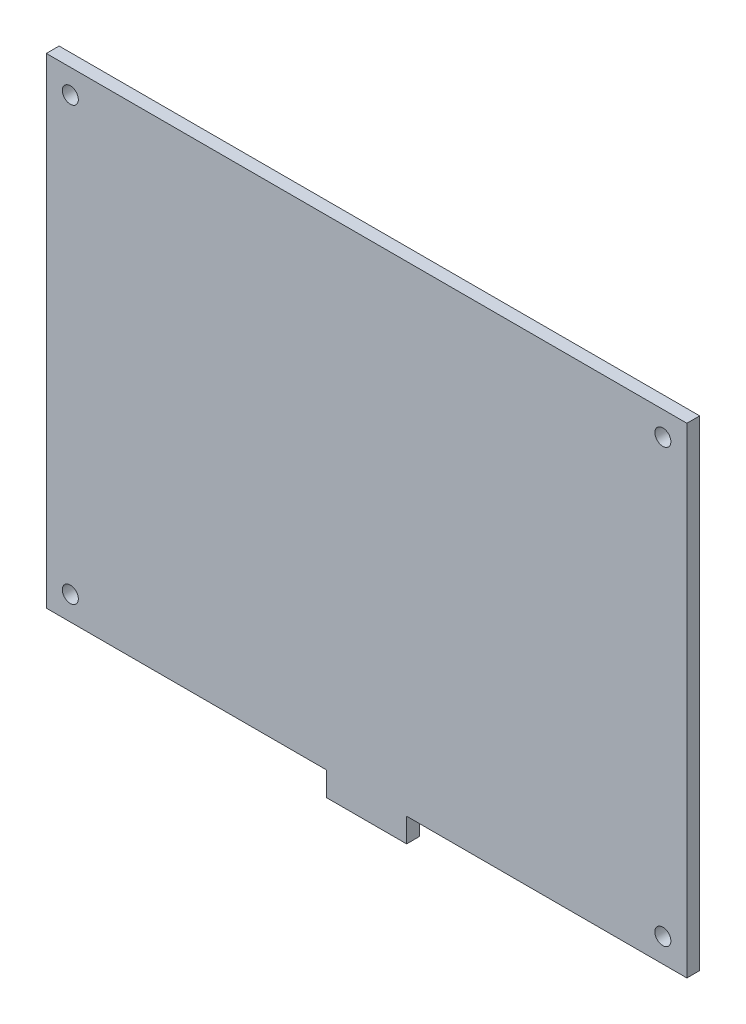
ISO-10303-21;
HEADER;
FILE_DESCRIPTION(('STEP AP214'),'2;1');
FILE_NAME('part.step','',(''),(''),'','','');
FILE_SCHEMA(('AUTOMOTIVE_DESIGN { 1 0 10303 214 1 1 1 1 }'));
ENDSEC;
DATA;
#1=APPLICATION_CONTEXT('core data for automotive mechanical design processes');
#2=APPLICATION_PROTOCOL_DEFINITION('international standard','automotive_design',2000,#1);
#3=PRODUCT_CONTEXT('',#1,'mechanical');
#4=PRODUCT('Part','Part','',(#3));
#5=PRODUCT_RELATED_PRODUCT_CATEGORY('part','',(#4));
#6=PRODUCT_DEFINITION_FORMATION('','',#4);
#7=PRODUCT_DEFINITION_CONTEXT('part definition',#1,'design');
#8=PRODUCT_DEFINITION('design','',#6,#7);
#9=PRODUCT_DEFINITION_SHAPE('','',#8);
#10=(LENGTH_UNIT() NAMED_UNIT(*) SI_UNIT(.MILLI.,.METRE.));
#11=(NAMED_UNIT(*) PLANE_ANGLE_UNIT() SI_UNIT($,.RADIAN.));
#12=(NAMED_UNIT(*) SI_UNIT($,.STERADIAN.) SOLID_ANGLE_UNIT());
#13=UNCERTAINTY_MEASURE_WITH_UNIT(LENGTH_MEASURE(1.E-05),#10,'distance_accuracy_value','');
#14=(GEOMETRIC_REPRESENTATION_CONTEXT(3) GLOBAL_UNCERTAINTY_ASSIGNED_CONTEXT((#13)) GLOBAL_UNIT_ASSIGNED_CONTEXT((#10,
#11,#12)) REPRESENTATION_CONTEXT('',''));
#15=CARTESIAN_POINT('',(0.,0.,0.));
#16=DIRECTION('',(0.,0.,1.));
#17=DIRECTION('',(1.,0.,0.));
#18=AXIS2_PLACEMENT_3D('',#15,#16,#17);
#19=CARTESIAN_POINT('',(37.,-27.,1.6));
#20=DIRECTION('',(0.,0.,-1.));
#21=DIRECTION('',(-1.,0.,0.));
#22=AXIS2_PLACEMENT_3D('',#19,#20,#21);
#23=CYLINDRICAL_SURFACE('',#22,0.999999999999998);
#24=CARTESIAN_POINT('',(37.,-27.,1.6));
#25=DIRECTION('',(0.,0.,1.));
#26=DIRECTION('',(1.,0.,0.));
#27=AXIS2_PLACEMENT_3D('',#24,#25,#26);
#28=CIRCLE('',#27,0.999999999999998);
#29=CARTESIAN_POINT('',(38.,-27.,1.6));
#30=VERTEX_POINT('',#29);
#31=EDGE_CURVE('E417',#30,#30,#28,.T.);
#32=ORIENTED_EDGE('',*,*,#31,.T.);
#33=EDGE_LOOP('',(#32));
#34=FACE_BOUND('',#33,.T.);
#35=CARTESIAN_POINT('',(37.,-27.,0.));
#36=DIRECTION('',(0.,0.,1.));
#37=DIRECTION('',(1.,0.,0.));
#38=AXIS2_PLACEMENT_3D('',#35,#36,#37);
#39=CIRCLE('',#38,0.999999999999998);
#40=CARTESIAN_POINT('',(38.,-27.,0.));
#41=VERTEX_POINT('',#40);
#42=EDGE_CURVE('E416',#41,#41,#39,.T.);
#43=ORIENTED_EDGE('',*,*,#42,.F.);
#44=EDGE_LOOP('',(#43));
#45=FACE_BOUND('',#44,.T.);
#46=ADVANCED_FACE('F99',(#34,#45),#23,.F.);
#47=CARTESIAN_POINT('',(-37.,27.,1.6));
#48=DIRECTION('',(0.,0.,-1.));
#49=DIRECTION('',(-1.,0.,0.));
#50=AXIS2_PLACEMENT_3D('',#47,#48,#49);
#51=CYLINDRICAL_SURFACE('',#50,0.999999999999998);
#52=CARTESIAN_POINT('',(-37.,27.,1.6));
#53=DIRECTION('',(0.,0.,1.));
#54=DIRECTION('',(1.,0.,0.));
#55=AXIS2_PLACEMENT_3D('',#52,#53,#54);
#56=CIRCLE('',#55,0.999999999999998);
#57=CARTESIAN_POINT('',(-36.,27.,1.6));
#58=VERTEX_POINT('',#57);
#59=EDGE_CURVE('E232',#58,#58,#56,.T.);
#60=ORIENTED_EDGE('',*,*,#59,.T.);
#61=EDGE_LOOP('',(#60));
#62=FACE_BOUND('',#61,.T.);
#63=CARTESIAN_POINT('',(-37.,27.,0.));
#64=DIRECTION('',(0.,0.,1.));
#65=DIRECTION('',(1.,0.,0.));
#66=AXIS2_PLACEMENT_3D('',#63,#64,#65);
#67=CIRCLE('',#66,0.999999999999998);
#68=CARTESIAN_POINT('',(-36.,27.,0.));
#69=VERTEX_POINT('',#68);
#70=EDGE_CURVE('E235',#69,#69,#67,.T.);
#71=ORIENTED_EDGE('',*,*,#70,.F.);
#72=EDGE_LOOP('',(#71));
#73=FACE_BOUND('',#72,.T.);
#74=ADVANCED_FACE('F268',(#62,#73),#51,.F.);
#75=CARTESIAN_POINT('',(-40.,30.,1.6));
#76=DIRECTION('',(0.,1.,0.));
#77=DIRECTION('',(0.,0.,1.));
#78=AXIS2_PLACEMENT_3D('',#75,#76,#77);
#79=PLANE('',#78);
#80=DIRECTION('',(1.,0.,0.));
#81=VECTOR('',#80,1.);
#82=CARTESIAN_POINT('',(-40.,30.,0.));
#83=LINE('',#82,#81);
#84=CARTESIAN_POINT('',(-40.,30.,0.));
#85=VERTEX_POINT('',#84);
#86=CARTESIAN_POINT('',(40.,30.,0.));
#87=VERTEX_POINT('',#86);
#88=EDGE_CURVE('E191',#85,#87,#83,.T.);
#89=ORIENTED_EDGE('',*,*,#88,.F.);
#90=DIRECTION('',(0.,0.,-1.));
#91=VECTOR('',#90,1.);
#92=CARTESIAN_POINT('',(-40.,30.,1.6));
#93=LINE('',#92,#91);
#94=CARTESIAN_POINT('',(-40.,30.,1.6));
#95=VERTEX_POINT('',#94);
#96=EDGE_CURVE('E200',#95,#85,#93,.T.);
#97=ORIENTED_EDGE('',*,*,#96,.F.);
#98=DIRECTION('',(1.,0.,0.));
#99=VECTOR('',#98,1.);
#100=CARTESIAN_POINT('',(-40.,30.,1.6));
#101=LINE('',#100,#99);
#102=CARTESIAN_POINT('',(40.,30.,1.6));
#103=VERTEX_POINT('',#102);
#104=EDGE_CURVE('E202',#95,#103,#101,.T.);
#105=ORIENTED_EDGE('',*,*,#104,.T.);
#106=DIRECTION('',(0.,0.,-1.));
#107=VECTOR('',#106,1.);
#108=CARTESIAN_POINT('',(40.,30.,1.6));
#109=LINE('',#108,#107);
#110=EDGE_CURVE('E176',#103,#87,#109,.T.);
#111=ORIENTED_EDGE('',*,*,#110,.T.);
#112=EDGE_LOOP('',(#89,#97,#105,#111));
#113=FACE_BOUND('',#112,.T.);
#114=ADVANCED_FACE('F210',(#113),#79,.T.);
#115=CARTESIAN_POINT('',(-37.,-27.,1.6));
#116=DIRECTION('',(0.,0.,-1.));
#117=DIRECTION('',(-1.,0.,0.));
#118=AXIS2_PLACEMENT_3D('',#115,#116,#117);
#119=CYLINDRICAL_SURFACE('',#118,0.999999999999998);
#120=CARTESIAN_POINT('',(-37.,-27.,1.6));
#121=DIRECTION('',(0.,0.,1.));
#122=DIRECTION('',(1.,0.,0.));
#123=AXIS2_PLACEMENT_3D('',#120,#121,#122);
#124=CIRCLE('',#123,0.999999999999998);
#125=CARTESIAN_POINT('',(-36.,-27.,1.6));
#126=VERTEX_POINT('',#125);
#127=EDGE_CURVE('E225',#126,#126,#124,.T.);
#128=ORIENTED_EDGE('',*,*,#127,.T.);
#129=EDGE_LOOP('',(#128));
#130=FACE_BOUND('',#129,.T.);
#131=CARTESIAN_POINT('',(-37.,-27.,0.));
#132=DIRECTION('',(0.,0.,1.));
#133=DIRECTION('',(1.,0.,0.));
#134=AXIS2_PLACEMENT_3D('',#131,#132,#133);
#135=CIRCLE('',#134,0.999999999999998);
#136=CARTESIAN_POINT('',(-36.,-27.,0.));
#137=VERTEX_POINT('',#136);
#138=EDGE_CURVE('E227',#137,#137,#135,.T.);
#139=ORIENTED_EDGE('',*,*,#138,.F.);
#140=EDGE_LOOP('',(#139));
#141=FACE_BOUND('',#140,.T.);
#142=ADVANCED_FACE('F282',(#130,#141),#119,.F.);
#143=CARTESIAN_POINT('',(37.,27.,1.6));
#144=DIRECTION('',(0.,0.,-1.));
#145=DIRECTION('',(-1.,0.,0.));
#146=AXIS2_PLACEMENT_3D('',#143,#144,#145);
#147=CYLINDRICAL_SURFACE('',#146,0.999999999999998);
#148=CARTESIAN_POINT('',(37.,27.,1.6));
#149=DIRECTION('',(0.,0.,1.));
#150=DIRECTION('',(1.,0.,0.));
#151=AXIS2_PLACEMENT_3D('',#148,#149,#150);
#152=CIRCLE('',#151,0.999999999999998);
#153=CARTESIAN_POINT('',(38.,27.,1.6));
#154=VERTEX_POINT('',#153);
#155=EDGE_CURVE('E421',#154,#154,#152,.T.);
#156=ORIENTED_EDGE('',*,*,#155,.T.);
#157=EDGE_LOOP('',(#156));
#158=FACE_BOUND('',#157,.T.);
#159=CARTESIAN_POINT('',(37.,27.,0.));
#160=DIRECTION('',(0.,0.,1.));
#161=DIRECTION('',(1.,0.,0.));
#162=AXIS2_PLACEMENT_3D('',#159,#160,#161);
#163=CIRCLE('',#162,0.999999999999998);
#164=CARTESIAN_POINT('',(38.,27.,0.));
#165=VERTEX_POINT('',#164);
#166=EDGE_CURVE('E413',#165,#165,#163,.T.);
#167=ORIENTED_EDGE('',*,*,#166,.F.);
#168=EDGE_LOOP('',(#167));
#169=FACE_BOUND('',#168,.T.);
#170=ADVANCED_FACE('F279',(#158,#169),#147,.F.);
#171=CARTESIAN_POINT('',(-40.,30.,1.6));
#172=DIRECTION('',(1.,0.,0.));
#173=DIRECTION('',(0.,0.,-1.));
#174=AXIS2_PLACEMENT_3D('',#171,#172,#173);
#175=PLANE('',#174);
#176=DIRECTION('',(0.,-1.,0.));
#177=VECTOR('',#176,1.);
#178=CARTESIAN_POINT('',(-40.,30.,0.));
#179=LINE('',#178,#177);
#180=CARTESIAN_POINT('',(-40.,-30.,0.));
#181=VERTEX_POINT('',#180);
#182=EDGE_CURVE('E193',#85,#181,#179,.T.);
#183=ORIENTED_EDGE('',*,*,#182,.T.);
#184=DIRECTION('',(0.,0.,-1.));
#185=VECTOR('',#184,1.);
#186=CARTESIAN_POINT('',(-40.,-30.,1.6));
#187=LINE('',#186,#185);
#188=CARTESIAN_POINT('',(-40.,-30.,1.6));
#189=VERTEX_POINT('',#188);
#190=EDGE_CURVE('E164',#189,#181,#187,.T.);
#191=ORIENTED_EDGE('',*,*,#190,.F.);
#192=DIRECTION('',(0.,-1.,0.));
#193=VECTOR('',#192,1.);
#194=CARTESIAN_POINT('',(-40.,30.,1.6));
#195=LINE('',#194,#193);
#196=EDGE_CURVE('E199',#95,#189,#195,.T.);
#197=ORIENTED_EDGE('',*,*,#196,.F.);
#198=ORIENTED_EDGE('',*,*,#96,.T.);
#199=EDGE_LOOP('',(#183,#191,#197,#198));
#200=FACE_BOUND('',#199,.T.);
#201=ADVANCED_FACE('F281',(#200),#175,.F.);
#202=CARTESIAN_POINT('',(40.,30.,1.6));
#203=DIRECTION('',(1.,0.,0.));
#204=DIRECTION('',(0.,0.,-1.));
#205=AXIS2_PLACEMENT_3D('',#202,#203,#204);
#206=PLANE('',#205);
#207=DIRECTION('',(0.,-1.,0.));
#208=VECTOR('',#207,1.);
#209=CARTESIAN_POINT('',(40.,30.,0.));
#210=LINE('',#209,#208);
#211=CARTESIAN_POINT('',(40.,-30.,0.));
#212=VERTEX_POINT('',#211);
#213=EDGE_CURVE('E189',#87,#212,#210,.T.);
#214=ORIENTED_EDGE('',*,*,#213,.F.);
#215=ORIENTED_EDGE('',*,*,#110,.F.);
#216=DIRECTION('',(0.,-1.,0.));
#217=VECTOR('',#216,1.);
#218=CARTESIAN_POINT('',(40.,30.,1.6));
#219=LINE('',#218,#217);
#220=CARTESIAN_POINT('',(40.,-30.,1.6));
#221=VERTEX_POINT('',#220);
#222=EDGE_CURVE('E244',#103,#221,#219,.T.);
#223=ORIENTED_EDGE('',*,*,#222,.T.);
#224=DIRECTION('',(0.,0.,-1.));
#225=VECTOR('',#224,1.);
#226=CARTESIAN_POINT('',(40.,-30.,1.6));
#227=LINE('',#226,#225);
#228=EDGE_CURVE('E168',#221,#212,#227,.T.);
#229=ORIENTED_EDGE('',*,*,#228,.T.);
#230=EDGE_LOOP('',(#214,#215,#223,#229));
#231=FACE_BOUND('',#230,.T.);
#232=ADVANCED_FACE('F220',(#231),#206,.T.);
#233=CARTESIAN_POINT('',(0.,0.,0.));
#234=DIRECTION('',(0.,0.,1.));
#235=DIRECTION('',(1.,0.,0.));
#236=AXIS2_PLACEMENT_3D('',#233,#234,#235);
#237=PLANE('',#236);
#238=ORIENTED_EDGE('',*,*,#182,.F.);
#239=ORIENTED_EDGE('',*,*,#88,.T.);
#240=ORIENTED_EDGE('',*,*,#213,.T.);
#241=DIRECTION('',(1.,0.,0.));
#242=VECTOR('',#241,1.);
#243=CARTESIAN_POINT('',(-40.,-30.,0.));
#244=LINE('',#243,#242);
#245=CARTESIAN_POINT('',(5.,-30.,0.));
#246=VERTEX_POINT('',#245);
#247=EDGE_CURVE('E156',#246,#212,#244,.T.);
#248=ORIENTED_EDGE('',*,*,#247,.F.);
#249=DIRECTION('',(0.,-1.,0.));
#250=VECTOR('',#249,1.);
#251=CARTESIAN_POINT('',(5.,-30.,0.));
#252=LINE('',#251,#250);
#253=CARTESIAN_POINT('',(5.,-33.,0.));
#254=VERTEX_POINT('',#253);
#255=EDGE_CURVE('E142',#246,#254,#252,.T.);
#256=ORIENTED_EDGE('',*,*,#255,.T.);
#257=DIRECTION('',(1.,0.,0.));
#258=VECTOR('',#257,1.);
#259=CARTESIAN_POINT('',(-5.,-33.,0.));
#260=LINE('',#259,#258);
#261=CARTESIAN_POINT('',(-5.,-33.,0.));
#262=VERTEX_POINT('',#261);
#263=EDGE_CURVE('E136',#262,#254,#260,.T.);
#264=ORIENTED_EDGE('',*,*,#263,.F.);
#265=DIRECTION('',(0.,-1.,0.));
#266=VECTOR('',#265,1.);
#267=CARTESIAN_POINT('',(-5.,-30.,0.));
#268=LINE('',#267,#266);
#269=CARTESIAN_POINT('',(-5.,-30.,0.));
#270=VERTEX_POINT('',#269);
#271=EDGE_CURVE('E149',#270,#262,#268,.T.);
#272=ORIENTED_EDGE('',*,*,#271,.F.);
#273=EDGE_CURVE('E185',#181,#270,#244,.T.);
#274=ORIENTED_EDGE('',*,*,#273,.F.);
#275=EDGE_LOOP('',(#238,#239,#240,#248,#256,#264,#272,#274));
#276=FACE_BOUND('',#275,.T.);
#277=ORIENTED_EDGE('',*,*,#138,.T.);
#278=EDGE_LOOP('',(#277));
#279=FACE_BOUND('',#278,.T.);
#280=ORIENTED_EDGE('',*,*,#70,.T.);
#281=EDGE_LOOP('',(#280));
#282=FACE_BOUND('',#281,.T.);
#283=ORIENTED_EDGE('',*,*,#166,.T.);
#284=EDGE_LOOP('',(#283));
#285=FACE_BOUND('',#284,.T.);
#286=ORIENTED_EDGE('',*,*,#42,.T.);
#287=EDGE_LOOP('',(#286));
#288=FACE_BOUND('',#287,.T.);
#289=ADVANCED_FACE('F152',(#276,#279,#282,#285,#288),#237,.F.);
#290=CARTESIAN_POINT('',(0.,0.,1.6));
#291=DIRECTION('',(0.,0.,1.));
#292=DIRECTION('',(1.,0.,0.));
#293=AXIS2_PLACEMENT_3D('',#290,#291,#292);
#294=PLANE('',#293);
#295=ORIENTED_EDGE('',*,*,#155,.F.);
#296=EDGE_LOOP('',(#295));
#297=FACE_BOUND('',#296,.T.);
#298=ORIENTED_EDGE('',*,*,#127,.F.);
#299=EDGE_LOOP('',(#298));
#300=FACE_BOUND('',#299,.T.);
#301=ORIENTED_EDGE('',*,*,#196,.T.);
#302=DIRECTION('',(1.,0.,0.));
#303=VECTOR('',#302,1.);
#304=CARTESIAN_POINT('',(-40.,-30.,1.6));
#305=LINE('',#304,#303);
#306=CARTESIAN_POINT('',(-5.,-30.,1.6));
#307=VERTEX_POINT('',#306);
#308=EDGE_CURVE('E241',#189,#307,#305,.T.);
#309=ORIENTED_EDGE('',*,*,#308,.T.);
#310=DIRECTION('',(0.,-1.,0.));
#311=VECTOR('',#310,1.);
#312=CARTESIAN_POINT('',(-5.,-30.,1.6));
#313=LINE('',#312,#311);
#314=CARTESIAN_POINT('',(-5.,-33.,1.6));
#315=VERTEX_POINT('',#314);
#316=EDGE_CURVE('E157',#307,#315,#313,.T.);
#317=ORIENTED_EDGE('',*,*,#316,.T.);
#318=DIRECTION('',(1.,0.,0.));
#319=VECTOR('',#318,1.);
#320=CARTESIAN_POINT('',(-5.,-33.,1.6));
#321=LINE('',#320,#319);
#322=CARTESIAN_POINT('',(5.,-33.,1.6));
#323=VERTEX_POINT('',#322);
#324=EDGE_CURVE('E160',#315,#323,#321,.T.);
#325=ORIENTED_EDGE('',*,*,#324,.T.);
#326=DIRECTION('',(0.,-1.,0.));
#327=VECTOR('',#326,1.);
#328=CARTESIAN_POINT('',(5.,-30.,1.6));
#329=LINE('',#328,#327);
#330=CARTESIAN_POINT('',(5.,-30.,1.6));
#331=VERTEX_POINT('',#330);
#332=EDGE_CURVE('E144',#331,#323,#329,.T.);
#333=ORIENTED_EDGE('',*,*,#332,.F.);
#334=EDGE_CURVE('E240',#331,#221,#305,.T.);
#335=ORIENTED_EDGE('',*,*,#334,.T.);
#336=ORIENTED_EDGE('',*,*,#222,.F.);
#337=ORIENTED_EDGE('',*,*,#104,.F.);
#338=EDGE_LOOP('',(#301,#309,#317,#325,#333,#335,#336,#337));
#339=FACE_BOUND('',#338,.T.);
#340=ORIENTED_EDGE('',*,*,#59,.F.);
#341=EDGE_LOOP('',(#340));
#342=FACE_BOUND('',#341,.T.);
#343=ORIENTED_EDGE('',*,*,#31,.F.);
#344=EDGE_LOOP('',(#343));
#345=FACE_BOUND('',#344,.T.);
#346=ADVANCED_FACE('F249',(#297,#300,#339,#342,#345),#294,.T.);
#347=CARTESIAN_POINT('',(-40.,-30.,1.6));
#348=DIRECTION('',(0.,1.,0.));
#349=DIRECTION('',(0.,0.,1.));
#350=AXIS2_PLACEMENT_3D('',#347,#348,#349);
#351=PLANE('',#350);
#352=ORIENTED_EDGE('',*,*,#334,.F.);
#353=DIRECTION('',(0.,0.,-1.));
#354=VECTOR('',#353,1.);
#355=CARTESIAN_POINT('',(5.,-30.,1.6));
#356=LINE('',#355,#354);
#357=EDGE_CURVE('E109',#331,#246,#356,.T.);
#358=ORIENTED_EDGE('',*,*,#357,.T.);
#359=ORIENTED_EDGE('',*,*,#247,.T.);
#360=ORIENTED_EDGE('',*,*,#228,.F.);
#361=EDGE_LOOP('',(#352,#358,#359,#360));
#362=FACE_BOUND('',#361,.T.);
#363=ADVANCED_FACE('F256',(#362),#351,.F.);
#364=DIRECTION('',(0.,0.,-1.));
#365=VECTOR('',#364,1.);
#366=CARTESIAN_POINT('',(-5.,-30.,1.6));
#367=LINE('',#366,#365);
#368=EDGE_CURVE('E12',#307,#270,#367,.T.);
#369=ORIENTED_EDGE('',*,*,#368,.F.);
#370=ORIENTED_EDGE('',*,*,#308,.F.);
#371=ORIENTED_EDGE('',*,*,#190,.T.);
#372=ORIENTED_EDGE('',*,*,#273,.T.);
#373=EDGE_LOOP('',(#369,#370,#371,#372));
#374=FACE_BOUND('',#373,.T.);
#375=ADVANCED_FACE('F188',(#374),#351,.F.);
#376=CARTESIAN_POINT('',(-5.,-33.,1.6));
#377=DIRECTION('',(0.,1.,0.));
#378=DIRECTION('',(0.,0.,1.));
#379=AXIS2_PLACEMENT_3D('',#376,#377,#378);
#380=PLANE('',#379);
#381=ORIENTED_EDGE('',*,*,#263,.T.);
#382=DIRECTION('',(0.,0.,-1.));
#383=VECTOR('',#382,1.);
#384=CARTESIAN_POINT('',(5.,-33.,1.6));
#385=LINE('',#384,#383);
#386=EDGE_CURVE('E140',#323,#254,#385,.T.);
#387=ORIENTED_EDGE('',*,*,#386,.F.);
#388=ORIENTED_EDGE('',*,*,#324,.F.);
#389=DIRECTION('',(0.,0.,-1.));
#390=VECTOR('',#389,1.);
#391=CARTESIAN_POINT('',(-5.,-33.,1.6));
#392=LINE('',#391,#390);
#393=EDGE_CURVE('E103',#315,#262,#392,.T.);
#394=ORIENTED_EDGE('',*,*,#393,.T.);
#395=EDGE_LOOP('',(#381,#387,#388,#394));
#396=FACE_BOUND('',#395,.T.);
#397=ADVANCED_FACE('F146',(#396),#380,.F.);
#398=CARTESIAN_POINT('',(5.,-30.,1.6));
#399=DIRECTION('',(1.,0.,0.));
#400=DIRECTION('',(0.,1.,0.));
#401=AXIS2_PLACEMENT_3D('',#398,#399,#400);
#402=PLANE('',#401);
#403=ORIENTED_EDGE('',*,*,#255,.F.);
#404=ORIENTED_EDGE('',*,*,#357,.F.);
#405=ORIENTED_EDGE('',*,*,#332,.T.);
#406=ORIENTED_EDGE('',*,*,#386,.T.);
#407=EDGE_LOOP('',(#403,#404,#405,#406));
#408=FACE_BOUND('',#407,.T.);
#409=ADVANCED_FACE('F141',(#408),#402,.T.);
#410=CARTESIAN_POINT('',(-5.,-30.,1.6));
#411=DIRECTION('',(1.,0.,0.));
#412=DIRECTION('',(0.,1.,0.));
#413=AXIS2_PLACEMENT_3D('',#410,#411,#412);
#414=PLANE('',#413);
#415=ORIENTED_EDGE('',*,*,#271,.T.);
#416=ORIENTED_EDGE('',*,*,#393,.F.);
#417=ORIENTED_EDGE('',*,*,#316,.F.);
#418=ORIENTED_EDGE('',*,*,#368,.T.);
#419=EDGE_LOOP('',(#415,#416,#417,#418));
#420=FACE_BOUND('',#419,.T.);
#421=ADVANCED_FACE('F101',(#420),#414,.F.);
#422=CLOSED_SHELL('',(#46,#74,#114,#142,#170,#201,#232,#289,#346,#363,#375,#397,#409,#421));
#423=MANIFOLD_SOLID_BREP('B2',#422);
#424=ADVANCED_BREP_SHAPE_REPRESENTATION('',(#18,#423),#14);
#425=SHAPE_DEFINITION_REPRESENTATION(#9,#424);
ENDSEC;
END-ISO-10303-21;
